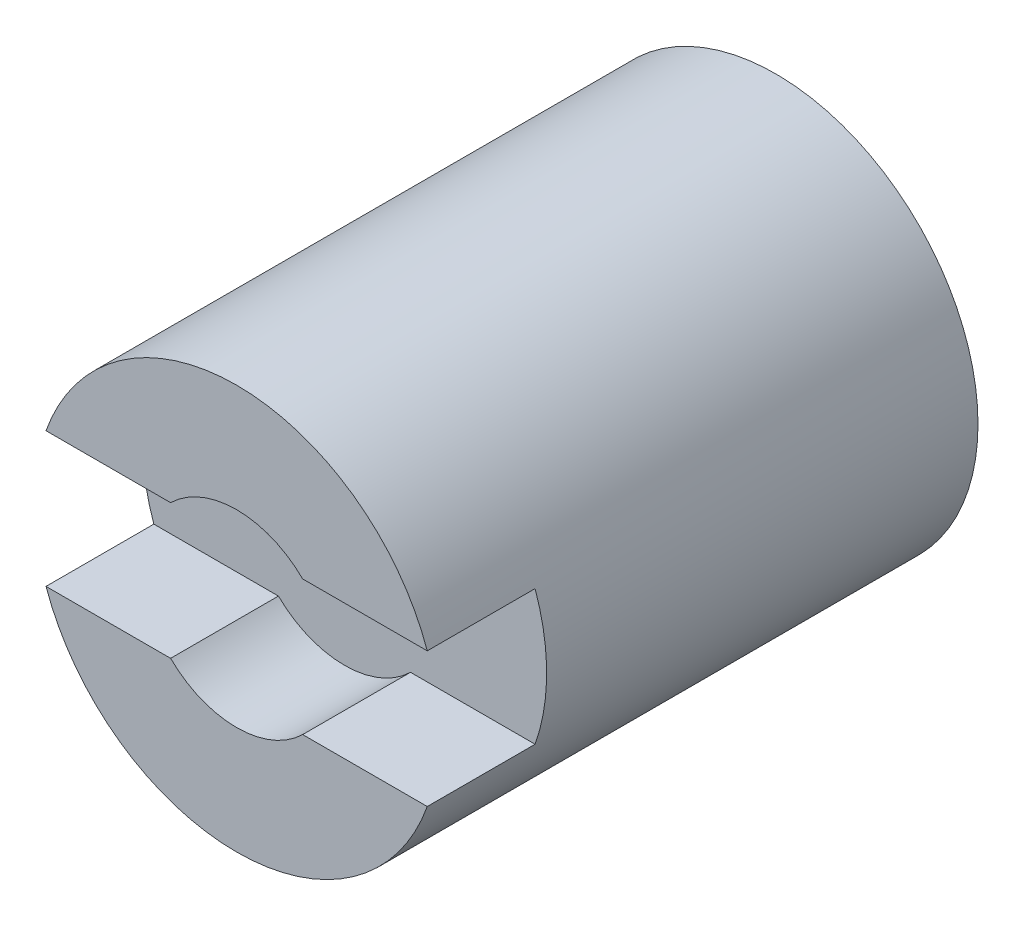
ISO-10303-21;
HEADER;
FILE_DESCRIPTION(('STEP AP214'),'2;1');
FILE_NAME('part.step','',(''),(''),'','','');
FILE_SCHEMA(('AUTOMOTIVE_DESIGN { 1 0 10303 214 1 1 1 1 }'));
ENDSEC;
DATA;
#1=APPLICATION_CONTEXT('core data for automotive mechanical design processes');
#2=APPLICATION_PROTOCOL_DEFINITION('international standard','automotive_design',2000,#1);
#3=PRODUCT_CONTEXT('',#1,'mechanical');
#4=PRODUCT('Part','Part','',(#3));
#5=PRODUCT_RELATED_PRODUCT_CATEGORY('part','',(#4));
#6=PRODUCT_DEFINITION_FORMATION('','',#4);
#7=PRODUCT_DEFINITION_CONTEXT('part definition',#1,'design');
#8=PRODUCT_DEFINITION('design','',#6,#7);
#9=PRODUCT_DEFINITION_SHAPE('','',#8);
#10=(LENGTH_UNIT() NAMED_UNIT(*) SI_UNIT(.MILLI.,.METRE.));
#11=(NAMED_UNIT(*) PLANE_ANGLE_UNIT() SI_UNIT($,.RADIAN.));
#12=(NAMED_UNIT(*) SI_UNIT($,.STERADIAN.) SOLID_ANGLE_UNIT());
#13=UNCERTAINTY_MEASURE_WITH_UNIT(LENGTH_MEASURE(1.E-05),#10,'distance_accuracy_value','');
#14=(GEOMETRIC_REPRESENTATION_CONTEXT(3) GLOBAL_UNCERTAINTY_ASSIGNED_CONTEXT((#13)) GLOBAL_UNIT_ASSIGNED_CONTEXT((#10,
#11,#12)) REPRESENTATION_CONTEXT('',''));
#15=CARTESIAN_POINT('',(0.,0.,0.));
#16=DIRECTION('',(0.,0.,1.));
#17=DIRECTION('',(1.,0.,0.));
#18=AXIS2_PLACEMENT_3D('',#15,#16,#17);
#19=CARTESIAN_POINT('',(0.,0.,20.));
#20=DIRECTION('',(0.,0.,1.));
#21=DIRECTION('',(1.,0.,0.));
#22=AXIS2_PLACEMENT_3D('',#19,#20,#21);
#23=PLANE('',#22);
#24=DIRECTION('',(-1.,0.,0.));
#25=VECTOR('',#24,1.);
#26=CARTESIAN_POINT('',(-9.,2.5,20.));
#27=LINE('',#26,#25);
#28=CARTESIAN_POINT('',(7.07106781186547,2.5,20.));
#29=VERTEX_POINT('',#28);
#30=CARTESIAN_POINT('',(2.44948974278318,2.5,20.));
#31=VERTEX_POINT('',#30);
#32=EDGE_CURVE('E197',#29,#31,#27,.T.);
#33=ORIENTED_EDGE('',*,*,#32,.F.);
#34=CARTESIAN_POINT('',(0.,0.,20.));
#35=DIRECTION('',(0.,0.,1.));
#36=DIRECTION('',(1.,0.,0.));
#37=AXIS2_PLACEMENT_3D('',#34,#35,#36);
#38=CIRCLE('',#37,7.5);
#39=CARTESIAN_POINT('',(-7.07106781186548,2.5,20.));
#40=VERTEX_POINT('',#39);
#41=EDGE_CURVE('E11',#29,#40,#38,.T.);
#42=ORIENTED_EDGE('',*,*,#41,.T.);
#43=CARTESIAN_POINT('',(-2.44948974278318,2.5,20.));
#44=VERTEX_POINT('',#43);
#45=EDGE_CURVE('E125',#44,#40,#27,.T.);
#46=ORIENTED_EDGE('',*,*,#45,.F.);
#47=CARTESIAN_POINT('',(0.,0.,20.));
#48=DIRECTION('',(0.,0.,1.));
#49=DIRECTION('',(1.,0.,0.));
#50=AXIS2_PLACEMENT_3D('',#47,#48,#49);
#51=CIRCLE('',#50,3.5);
#52=EDGE_CURVE('E135',#31,#44,#51,.T.);
#53=ORIENTED_EDGE('',*,*,#52,.F.);
#54=EDGE_LOOP('',(#33,#42,#46,#53));
#55=FACE_BOUND('',#54,.T.);
#56=ADVANCED_FACE('F35',(#55),#23,.T.);
#57=CARTESIAN_POINT('',(0.,0.,16.));
#58=DIRECTION('',(0.,0.,1.));
#59=DIRECTION('',(1.,0.,0.));
#60=AXIS2_PLACEMENT_3D('',#57,#58,#59);
#61=CYLINDRICAL_SURFACE('',#60,3.5);
#62=ORIENTED_EDGE('',*,*,#52,.T.);
#63=DIRECTION('',(0.,0.,1.));
#64=VECTOR('',#63,1.);
#65=CARTESIAN_POINT('',(-2.44948974278318,2.5,16.));
#66=LINE('',#65,#64);
#67=CARTESIAN_POINT('',(-2.44948974278318,2.5,16.));
#68=VERTEX_POINT('',#67);
#69=EDGE_CURVE('E211',#44,#68,#66,.F.);
#70=ORIENTED_EDGE('',*,*,#69,.T.);
#71=CARTESIAN_POINT('',(0.,0.,16.));
#72=DIRECTION('',(0.,0.,1.));
#73=DIRECTION('',(1.,0.,0.));
#74=AXIS2_PLACEMENT_3D('',#71,#72,#73);
#75=CIRCLE('',#74,3.5);
#76=CARTESIAN_POINT('',(2.44948974278318,2.5,16.));
#77=VERTEX_POINT('',#76);
#78=EDGE_CURVE('E133',#77,#68,#75,.T.);
#79=ORIENTED_EDGE('',*,*,#78,.F.);
#80=DIRECTION('',(0.,0.,1.));
#81=VECTOR('',#80,1.);
#82=CARTESIAN_POINT('',(2.44948974278318,2.5,16.));
#83=LINE('',#82,#81);
#84=EDGE_CURVE('E115',#77,#31,#83,.T.);
#85=ORIENTED_EDGE('',*,*,#84,.T.);
#86=EDGE_LOOP('',(#62,#70,#79,#85));
#87=FACE_BOUND('',#86,.T.);
#88=ADVANCED_FACE('F178',(#87),#61,.F.);
#89=CARTESIAN_POINT('',(0.,0.,20.));
#90=DIRECTION('',(0.,0.,-1.));
#91=DIRECTION('',(-1.,0.,0.));
#92=AXIS2_PLACEMENT_3D('',#89,#90,#91);
#93=CYLINDRICAL_SURFACE('',#92,7.5);
#94=CARTESIAN_POINT('',(0.,0.,16.));
#95=DIRECTION('',(0.,0.,1.));
#96=DIRECTION('',(1.,0.,0.));
#97=AXIS2_PLACEMENT_3D('',#94,#95,#96);
#98=CIRCLE('',#97,7.5);
#99=CARTESIAN_POINT('',(-7.07106781186548,2.5,16.));
#100=VERTEX_POINT('',#99);
#101=CARTESIAN_POINT('',(-7.07106781186548,-2.5,16.));
#102=VERTEX_POINT('',#101);
#103=EDGE_CURVE('E208',#100,#102,#98,.T.);
#104=ORIENTED_EDGE('',*,*,#103,.F.);
#105=DIRECTION('',(0.,0.,-1.));
#106=VECTOR('',#105,1.);
#107=CARTESIAN_POINT('',(-7.07106781186548,2.5,20.));
#108=LINE('',#107,#106);
#109=EDGE_CURVE('E207',#100,#40,#108,.F.);
#110=ORIENTED_EDGE('',*,*,#109,.T.);
#111=ORIENTED_EDGE('',*,*,#41,.F.);
#112=DIRECTION('',(0.,0.,-1.));
#113=VECTOR('',#112,1.);
#114=CARTESIAN_POINT('',(7.07106781186548,2.5,20.));
#115=LINE('',#114,#113);
#116=CARTESIAN_POINT('',(7.07106781186548,2.5,16.));
#117=VERTEX_POINT('',#116);
#118=EDGE_CURVE('E206',#29,#117,#115,.T.);
#119=ORIENTED_EDGE('',*,*,#118,.T.);
#120=CARTESIAN_POINT('',(7.07106781186548,-2.5,16.));
#121=VERTEX_POINT('',#120);
#122=EDGE_CURVE('E151',#121,#117,#98,.T.);
#123=ORIENTED_EDGE('',*,*,#122,.F.);
#124=DIRECTION('',(0.,0.,-1.));
#125=VECTOR('',#124,1.);
#126=CARTESIAN_POINT('',(7.07106781186548,-2.5,20.));
#127=LINE('',#126,#125);
#128=CARTESIAN_POINT('',(7.07106781186547,-2.5,20.));
#129=VERTEX_POINT('',#128);
#130=EDGE_CURVE('E116',#121,#129,#127,.F.);
#131=ORIENTED_EDGE('',*,*,#130,.T.);
#132=CARTESIAN_POINT('',(-7.07106781186548,-2.5,20.));
#133=VERTEX_POINT('',#132);
#134=EDGE_CURVE('E49',#133,#129,#38,.T.);
#135=ORIENTED_EDGE('',*,*,#134,.F.);
#136=DIRECTION('',(0.,0.,-1.));
#137=VECTOR('',#136,1.);
#138=CARTESIAN_POINT('',(-7.07106781186548,-2.5,20.));
#139=LINE('',#138,#137);
#140=EDGE_CURVE('E107',#133,#102,#139,.T.);
#141=ORIENTED_EDGE('',*,*,#140,.T.);
#142=EDGE_LOOP('',(#104,#110,#111,#119,#123,#131,#135,#141));
#143=FACE_BOUND('',#142,.T.);
#144=CARTESIAN_POINT('',(0.,-7.5,8.4));
#145=CARTESIAN_POINT('',(0.0779133674109521,-7.49999859125424,8.39999701606425));
#146=CARTESIAN_POINT('',(0.1558656317281,-7.49877336135813,8.39347392241294));
#147=CARTESIAN_POINT('',(0.309573945210475,-7.49400376714503,8.36757044773168));
#148=CARTESIAN_POINT('',(0.385328077045564,-7.4904574381938,8.34817917457057));
#149=CARTESIAN_POINT('',(0.532394902616653,-7.48144239226834,8.29715342074243));
#150=CARTESIAN_POINT('',(0.603711524827171,-7.47597540497422,8.2655299533969));
#151=CARTESIAN_POINT('',(0.740020082945075,-7.46371620380283,8.19096864543065));
#152=CARTESIAN_POINT('',(0.805012539027142,-7.45692409905732,8.14803173644098));
#153=CARTESIAN_POINT('',(0.927606272698275,-7.44267430493776,8.05152111041822));
#154=CARTESIAN_POINT('',(0.985121594567483,-7.43521030529913,7.99783912758889));
#155=CARTESIAN_POINT('',(1.09038485665154,-7.42050485674198,7.88159508808026));
#156=CARTESIAN_POINT('',(1.13813209897619,-7.41326342375634,7.81903239745046));
#157=CARTESIAN_POINT('',(1.22286079770395,-7.3997616811699,7.68619612490867));
#158=CARTESIAN_POINT('',(1.25975491870461,-7.3935095083739,7.61586593691635));
#159=CARTESIAN_POINT('',(1.32117102449928,-7.38278303352665,7.46986942491673));
#160=CARTESIAN_POINT('',(1.34569406634903,-7.37830857958388,7.3942035574503));
#161=CARTESIAN_POINT('',(1.38139624396322,-7.37170763757229,7.24060292392608));
#162=CARTESIAN_POINT('',(1.39272521996421,-7.36955480490632,7.1627041405356));
#163=CARTESIAN_POINT('',(1.4021827516858,-7.36776141784466,7.00608398167344));
#164=CARTESIAN_POINT('',(1.40031248054661,-7.36812064017918,6.92736267992761));
#165=CARTESIAN_POINT('',(1.38354613242022,-7.37128678738226,6.7724169984697));
#166=CARTESIAN_POINT('',(1.36882035466186,-7.37406170969313,6.69617344056423));
#167=CARTESIAN_POINT('',(1.3270291603155,-7.38169633260816,6.54725839154638));
#168=CARTESIAN_POINT('',(1.29996322359251,-7.38655612108846,6.47458705114524));
#169=CARTESIAN_POINT('',(1.23409321060501,-7.39784640181638,6.33438053732231));
#170=CARTESIAN_POINT('',(1.1952202876869,-7.40428606278954,6.26687847735335));
#171=CARTESIAN_POINT('',(1.10688846048193,-7.41800442531871,6.13929113271793));
#172=CARTESIAN_POINT('',(1.05742849105322,-7.4252832112634,6.07920659527351));
#173=CARTESIAN_POINT('',(0.94840797169838,-7.43999918071803,5.96717585534892));
#174=CARTESIAN_POINT('',(0.888701740330239,-7.4474370626664,5.91537140740493));
#175=CARTESIAN_POINT('',(0.761371236571213,-7.46152866848707,5.82249261726087));
#176=CARTESIAN_POINT('',(0.693746886132019,-7.46818238462862,5.78141838084058));
#177=CARTESIAN_POINT('',(0.552352497236687,-7.47996921746132,5.71114541179937));
#178=CARTESIAN_POINT('',(0.4785750114332,-7.48510045620092,5.68196132908119));
#179=CARTESIAN_POINT('',(0.327047822563483,-7.49324964825403,5.63643992209997));
#180=CARTESIAN_POINT('',(0.249298538581314,-7.49626782403512,5.62010124542414));
#181=CARTESIAN_POINT('',(0.093254429656113,-7.49982029245223,5.60093153725318));
#182=CARTESIAN_POINT('',(0.0149842535036367,-7.50039030063849,5.5979062644765));
#183=CARTESIAN_POINT('',(-0.140943599366161,-7.49908083147953,5.60492834119282));
#184=CARTESIAN_POINT('',(-0.218601305713759,-7.49720147337103,5.61497505433319));
#185=CARTESIAN_POINT('',(-0.370484374990088,-7.4912266743448,5.64769441976653));
#186=CARTESIAN_POINT('',(-0.444731629242859,-7.48714847562436,5.6702688756202));
#187=CARTESIAN_POINT('',(-0.588387527084438,-7.47723139159912,5.72729672386629));
#188=CARTESIAN_POINT('',(-0.657795844049151,-7.47139238758289,5.76175091719927));
#189=CARTESIAN_POINT('',(-0.79063321310229,-7.45851229738673,5.84199075585914));
#190=CARTESIAN_POINT('',(-0.853989283234835,-7.45145886519141,5.88789520092188));
#191=CARTESIAN_POINT('',(-0.972168673464306,-7.43696439317826,5.989571615031));
#192=CARTESIAN_POINT('',(-1.02699120347712,-7.42952331755519,6.04534449673365));
#193=CARTESIAN_POINT('',(-1.12728462577657,-7.41497385349456,6.16605362487332));
#194=CARTESIAN_POINT('',(-1.17262301470252,-7.40787112903525,6.23110076030566));
#195=CARTESIAN_POINT('',(-1.25172982219398,-7.39491622090559,6.36800191216051));
#196=CARTESIAN_POINT('',(-1.28549866837976,-7.3890639910189,6.43985567687881));
#197=CARTESIAN_POINT('',(-1.34031952638564,-7.37931705682305,6.58799260560827));
#198=CARTESIAN_POINT('',(-1.36143248761536,-7.3754129858809,6.6642525690897));
#199=CARTESIAN_POINT('',(-1.390530388651,-7.36998291741041,6.81931706000609));
#200=CARTESIAN_POINT('',(-1.39851679495834,-7.36845665423389,6.89812130219057));
#201=CARTESIAN_POINT('',(-1.40108615188244,-7.36796839970978,7.05471031204299));
#202=CARTESIAN_POINT('',(-1.39587809397871,-7.36896642490907,7.13249160271129));
#203=CARTESIAN_POINT('',(-1.37266367637821,-7.37332567909415,7.28604927437609));
#204=CARTESIAN_POINT('',(-1.35465739153333,-7.37668689425856,7.36182566709577));
#205=CARTESIAN_POINT('',(-1.30644549635851,-7.38537703463725,7.50911143559961));
#206=CARTESIAN_POINT('',(-1.27626232270117,-7.3907023393549,7.58062838304223));
#207=CARTESIAN_POINT('',(-1.20457623641904,-7.4027232291267,7.71761660298537));
#208=CARTESIAN_POINT('',(-1.16307253389003,-7.40941890979242,7.78308745318494));
#209=CARTESIAN_POINT('',(-1.06919613853274,-7.42355034378414,7.90717225641319));
#210=CARTESIAN_POINT('',(-1.01667127704805,-7.43099560595939,7.965670022843));
#211=CARTESIAN_POINT('',(-0.902561011125132,-7.44571597358462,8.07309122462733));
#212=CARTESIAN_POINT('',(-0.840973527873773,-7.45299103954952,8.12201245727018));
#213=CARTESIAN_POINT('',(-0.70982892852024,-7.46662732048264,8.20929881521798));
#214=CARTESIAN_POINT('',(-0.640205682766072,-7.47297981403672,8.24756598598391));
#215=CARTESIAN_POINT('',(-0.495422278764189,-7.48397004795432,8.31179900370326));
#216=CARTESIAN_POINT('',(-0.420267411958568,-7.4886094021508,8.33777643451281));
#217=CARTESIAN_POINT('',(-0.28740712601829,-7.49470196694218,8.37140266984245));
#218=CARTESIAN_POINT('',(-0.230479630074963,-7.49667753456189,8.38210838967683));
#219=CARTESIAN_POINT('',(-0.115708559017359,-7.499327057923,8.39640807378765));
#220=CARTESIAN_POINT('',(-0.0578650068755151,-7.50000104625286,8.40000221612117));
#221=CARTESIAN_POINT('',(0.,-7.5,8.4));
#222=B_SPLINE_CURVE_WITH_KNOTS('',3,(#144,#145,#146,#147,#148,#149,#150,#151,#152,#153,#154,
#155,#156,#157,#158,#159,#160,#161,#162,#163,#164,#165,#166,#167,#168,#169,#170,#171,#172,#173,
#174,#175,#176,#177,#178,#179,#180,#181,#182,#183,#184,#185,#186,#187,#188,#189,#190,#191,#192,
#193,#194,#195,#196,#197,#198,#199,#200,#201,#202,#203,#204,#205,#206,#207,#208,#209,#210,#211,
#212,#213,#214,#215,#216,#217,#218,#219,#220,#221),.UNSPECIFIED.,.T.,.F.,(4,2,2,2,2,2,2,2,2,2,2,
2,2,2,2,2,2,2,2,2,2,2,2,2,2,2,2,2,2,2,2,2,2,2,2,2,2,2,4),(0.,0.233528490493102,
0.467254901205797,0.700771363087736,0.934268601532527,1.17024907459718,1.40624640163875,
1.64409388270997,1.88192103728866,2.11702009284213,2.35209825321271,2.58410875235605,
2.81612903159522,3.04952907799129,3.28295261735168,3.5200216276816,3.75709297497979,
3.99445554179438,4.23179311483481,4.4656562257738,4.699507952533,4.93155204918364,
5.16361179347652,5.39818740209162,5.63278471616096,5.87046805589724,6.10814260970442,
6.34466315484716,6.5811572740696,6.81392898125117,7.04669932705199,7.27904272374926,
7.51140233664979,7.74721048008594,7.98307279850994,8.22103697750465,8.45877641114053,
8.63221861376357,8.80565647374898),.UNSPECIFIED.);
#223=CARTESIAN_POINT('',(0.,-7.5,8.4));
#224=VERTEX_POINT('',#223);
#225=EDGE_CURVE('E144',#224,#224,#222,.T.);
#226=ORIENTED_EDGE('',*,*,#225,.T.);
#227=EDGE_LOOP('',(#226));
#228=FACE_BOUND('',#227,.T.);
#229=CARTESIAN_POINT('',(0.,0.,0.));
#230=DIRECTION('',(0.,0.,1.));
#231=DIRECTION('',(1.,0.,0.));
#232=AXIS2_PLACEMENT_3D('',#229,#230,#231);
#233=CIRCLE('',#232,7.5);
#234=CARTESIAN_POINT('',(7.5,0.,0.));
#235=VERTEX_POINT('',#234);
#236=EDGE_CURVE('E131',#235,#235,#233,.T.);
#237=ORIENTED_EDGE('',*,*,#236,.T.);
#238=EDGE_LOOP('',(#237));
#239=FACE_BOUND('',#238,.T.);
#240=ADVANCED_FACE('F37',(#143,#228,#239),#93,.T.);
#241=DIRECTION('',(1.,0.,0.));
#242=VECTOR('',#241,1.);
#243=CARTESIAN_POINT('',(-9.,-2.5,20.));
#244=LINE('',#243,#242);
#245=CARTESIAN_POINT('',(-2.44948974278318,-2.5,20.));
#246=VERTEX_POINT('',#245);
#247=EDGE_CURVE('E110',#133,#246,#244,.T.);
#248=ORIENTED_EDGE('',*,*,#247,.F.);
#249=ORIENTED_EDGE('',*,*,#134,.T.);
#250=CARTESIAN_POINT('',(2.44948974278318,-2.5,20.));
#251=VERTEX_POINT('',#250);
#252=EDGE_CURVE('E126',#251,#129,#244,.T.);
#253=ORIENTED_EDGE('',*,*,#252,.F.);
#254=EDGE_CURVE('E124',#246,#251,#51,.T.);
#255=ORIENTED_EDGE('',*,*,#254,.F.);
#256=EDGE_LOOP('',(#248,#249,#253,#255));
#257=FACE_BOUND('',#256,.T.);
#258=ADVANCED_FACE('F121',(#257),#23,.T.);
#259=CARTESIAN_POINT('',(0.,0.,0.));
#260=DIRECTION('',(0.,0.,1.));
#261=DIRECTION('',(1.,0.,0.));
#262=AXIS2_PLACEMENT_3D('',#259,#260,#261);
#263=PLANE('',#262);
#264=CARTESIAN_POINT('',(0.,0.,0.));
#265=DIRECTION('',(0.,0.,-1.));
#266=DIRECTION('',(-1.,0.,0.));
#267=AXIS2_PLACEMENT_3D('',#264,#265,#266);
#268=CIRCLE('',#267,1.75);
#269=CARTESIAN_POINT('',(-1.75,0.,0.));
#270=VERTEX_POINT('',#269);
#271=EDGE_CURVE('E140',#270,#270,#268,.T.);
#272=ORIENTED_EDGE('',*,*,#271,.F.);
#273=EDGE_LOOP('',(#272));
#274=FACE_BOUND('',#273,.T.);
#275=ORIENTED_EDGE('',*,*,#236,.F.);
#276=EDGE_LOOP('',(#275));
#277=FACE_BOUND('',#276,.T.);
#278=ADVANCED_FACE('F176',(#274,#277),#263,.F.);
#279=ORIENTED_EDGE('',*,*,#254,.T.);
#280=DIRECTION('',(0.,0.,1.));
#281=VECTOR('',#280,1.);
#282=CARTESIAN_POINT('',(2.44948974278318,-2.5,16.));
#283=LINE('',#282,#281);
#284=CARTESIAN_POINT('',(2.44948974278318,-2.5,16.));
#285=VERTEX_POINT('',#284);
#286=EDGE_CURVE('E218',#251,#285,#283,.F.);
#287=ORIENTED_EDGE('',*,*,#286,.T.);
#288=CARTESIAN_POINT('',(-2.44948974278318,-2.5,16.));
#289=VERTEX_POINT('',#288);
#290=EDGE_CURVE('E138',#289,#285,#75,.T.);
#291=ORIENTED_EDGE('',*,*,#290,.F.);
#292=DIRECTION('',(0.,0.,1.));
#293=VECTOR('',#292,1.);
#294=CARTESIAN_POINT('',(-2.44948974278318,-2.5,16.));
#295=LINE('',#294,#293);
#296=EDGE_CURVE('E221',#289,#246,#295,.T.);
#297=ORIENTED_EDGE('',*,*,#296,.T.);
#298=EDGE_LOOP('',(#279,#287,#291,#297));
#299=FACE_BOUND('',#298,.T.);
#300=ADVANCED_FACE('F173',(#299),#61,.F.);
#301=CARTESIAN_POINT('',(0.,0.,16.));
#302=DIRECTION('',(0.,0.,1.));
#303=DIRECTION('',(1.,0.,0.));
#304=AXIS2_PLACEMENT_3D('',#301,#302,#303);
#305=PLANE('',#304);
#306=ORIENTED_EDGE('',*,*,#290,.T.);
#307=DIRECTION('',(1.,0.,0.));
#308=VECTOR('',#307,1.);
#309=CARTESIAN_POINT('',(-9.,-2.5,16.));
#310=LINE('',#309,#308);
#311=EDGE_CURVE('E202',#285,#121,#310,.T.);
#312=ORIENTED_EDGE('',*,*,#311,.T.);
#313=ORIENTED_EDGE('',*,*,#122,.T.);
#314=DIRECTION('',(-1.,0.,0.));
#315=VECTOR('',#314,1.);
#316=CARTESIAN_POINT('',(-9.,2.5,16.));
#317=LINE('',#316,#315);
#318=EDGE_CURVE('E64',#117,#77,#317,.T.);
#319=ORIENTED_EDGE('',*,*,#318,.T.);
#320=ORIENTED_EDGE('',*,*,#78,.T.);
#321=EDGE_CURVE('E223',#68,#100,#317,.T.);
#322=ORIENTED_EDGE('',*,*,#321,.T.);
#323=ORIENTED_EDGE('',*,*,#103,.T.);
#324=EDGE_CURVE('E57',#102,#289,#310,.T.);
#325=ORIENTED_EDGE('',*,*,#324,.T.);
#326=EDGE_LOOP('',(#306,#312,#313,#319,#320,#322,#323,#325));
#327=FACE_BOUND('',#326,.T.);
#328=ADVANCED_FACE('F169',(#327),#305,.T.);
#329=CARTESIAN_POINT('',(0.,0.,14.));
#330=DIRECTION('',(0.,0.,-1.));
#331=DIRECTION('',(-1.,0.,0.));
#332=AXIS2_PLACEMENT_3D('',#329,#330,#331);
#333=CYLINDRICAL_SURFACE('',#332,1.75);
#334=CARTESIAN_POINT('',(0.,-1.75,8.4));
#335=CARTESIAN_POINT('',(-0.0671979322416646,-1.74999491625747,8.39999476261131));
#336=CARTESIAN_POINT('',(-0.134493263163109,-1.74608959541021,8.39512141822933));
#337=CARTESIAN_POINT('',(-0.266923527684139,-1.73081486896077,8.37595502363645));
#338=CARTESIAN_POINT('',(-0.332053346498951,-1.71942895157439,8.36164113521492));
#339=CARTESIAN_POINT('',(-0.457866449255663,-1.69026705710654,8.32462520964426));
#340=CARTESIAN_POINT('',(-0.518575190713299,-1.67253184219989,8.30197665531606));
#341=CARTESIAN_POINT('',(-0.634848424561107,-1.63195207578548,8.24941785824782));
#342=CARTESIAN_POINT('',(-0.690412900653904,-1.60910750809172,8.21950759250329));
#343=CARTESIAN_POINT('',(-0.814226866427587,-1.55102965359143,8.14196014501928));
#344=CARTESIAN_POINT('',(-0.880157375887776,-1.51425224035371,8.09177675952338));
#345=CARTESIAN_POINT('',(-1.00128957457156,-1.43704534808961,7.9819053538367));
#346=CARTESIAN_POINT('',(-1.0564593306718,-1.39660550536807,7.92218997250839));
#347=CARTESIAN_POINT('',(-1.15651143275,-1.31499201144487,7.793258211189));
#348=CARTESIAN_POINT('',(-1.20121846921663,-1.27381681632366,7.72390725892719));
#349=CARTESIAN_POINT('',(-1.2785278408792,-1.1961747691715,7.57642285223663));
#350=CARTESIAN_POINT('',(-1.31117069570161,-1.1596924296223,7.49831996627632));
#351=CARTESIAN_POINT('',(-1.35160230640457,-1.11184956610758,7.36828473382731));
#352=CARTESIAN_POINT('',(-1.3640583307451,-1.09640109439161,7.31933178341412));
#353=CARTESIAN_POINT('',(-1.38371377758782,-1.07148922409054,7.21895112111535));
#354=CARTESIAN_POINT('',(-1.3909261231723,-1.0620111192581,7.16752982853242));
#355=CARTESIAN_POINT('',(-1.39957888099801,-1.0505896384278,7.06286523679036));
#356=CARTESIAN_POINT('',(-1.40096841929399,-1.04871267848591,7.00960996062547));
#357=CARTESIAN_POINT('',(-1.39768637189776,-1.05307973611965,6.90360657557706));
#358=CARTESIAN_POINT('',(-1.3930096565776,-1.05933062662169,6.85085893396358));
#359=CARTESIAN_POINT('',(-1.37686711898359,-1.0802450490998,6.7394443881711));
#360=CARTESIAN_POINT('',(-1.36445265743935,-1.09607289434669,6.68114439576221));
#361=CARTESIAN_POINT('',(-1.33311183144194,-1.13398221955396,6.56842510832406));
#362=CARTESIAN_POINT('',(-1.31416617949577,-1.15608218739051,6.51401789042209));
#363=CARTESIAN_POINT('',(-1.25981871535851,-1.21559281311588,6.38353652577137));
#364=CARTESIAN_POINT('',(-1.22090420616841,-1.25519361077691,6.30993811118731));
#365=CARTESIAN_POINT('',(-1.13146927248287,-1.33639646042498,6.17139832554022));
#366=CARTESIAN_POINT('',(-1.08093192831766,-1.37800135934319,6.10646979540861));
#367=CARTESIAN_POINT('',(-0.96702072828435,-1.4602892637785,5.98410766001738));
#368=CARTESIAN_POINT('',(-0.903340907187177,-1.50091822482303,5.9269196543895));
#369=CARTESIAN_POINT('',(-0.764389437510248,-1.57620310046738,5.82393035039245));
#370=CARTESIAN_POINT('',(-0.689149751646665,-1.61087494276619,5.77809853870474));
#371=CARTESIAN_POINT('',(-0.551444470062173,-1.66197209949679,5.71160600682247));
#372=CARTESIAN_POINT('',(-0.491524409116812,-1.68077749854839,5.68749684692305));
#373=CARTESIAN_POINT('',(-0.367439746629622,-1.71218294880071,5.64751148427804));
#374=CARTESIAN_POINT('',(-0.30327838544084,-1.72478767655511,5.63162907642608));
#375=CARTESIAN_POINT('',(-0.171999263640941,-1.74279234971933,5.60900301725761));
#376=CARTESIAN_POINT('',(-0.104867914860047,-1.74815465014742,5.60230711309967));
#377=CARTESIAN_POINT('',(0.0298256018185202,-1.75104077920124,5.59869866529554));
#378=CARTESIAN_POINT('',(0.0973876871251498,-1.74856606793902,5.60178429925311));
#379=CARTESIAN_POINT('',(0.225222672556177,-1.73653800951217,5.6168579728175));
#380=CARTESIAN_POINT('',(0.285642626554698,-1.72757446328525,5.62810442778419));
#381=CARTESIAN_POINT('',(0.403434969634318,-1.70392259604556,5.65801052158268));
#382=CARTESIAN_POINT('',(0.460806448543058,-1.68923257609215,5.67667236045587));
#383=CARTESIAN_POINT('',(0.574865123476419,-1.65402893198375,5.72190528075484));
#384=CARTESIAN_POINT('',(0.631290568876672,-1.63321133528393,5.7488941288802));
#385=CARTESIAN_POINT('',(0.738786967853227,-1.5874854129318,5.80920342742828));
#386=CARTESIAN_POINT('',(0.78985765420573,-1.56257688328469,5.84252419360578));
#387=CARTESIAN_POINT('',(0.895476819895458,-1.50495557306859,5.92145737284896));
#388=CARTESIAN_POINT('',(0.948855669960248,-1.47165781556883,5.96820260462305));
#389=CARTESIAN_POINT('',(1.04757517421973,-1.40310546129706,6.06856944754852));
#390=CARTESIAN_POINT('',(1.09289204235346,-1.36784546415289,6.12221062794266));
#391=CARTESIAN_POINT('',(1.15898087354498,-1.31161672095397,6.21350736286637));
#392=CARTESIAN_POINT('',(1.18240064338544,-1.29047640981302,6.24916234254161));
#393=CARTESIAN_POINT('',(1.22608056025509,-1.24905470822415,6.32282564873572));
#394=CARTESIAN_POINT('',(1.24633903119255,-1.22877377753466,6.36083520881383));
#395=CARTESIAN_POINT('',(1.3020124497182,-1.17051317292751,6.47823951749727));
#396=CARTESIAN_POINT('',(1.33260616745399,-1.13486282177681,6.56139203440472));
#397=CARTESIAN_POINT('',(1.36752585123894,-1.09213741882174,6.69628273161349));
#398=CARTESIAN_POINT('',(1.37745816815164,-1.07946841190278,6.74480178213238));
#399=CARTESIAN_POINT('',(1.39215109242793,-1.06045320725826,6.84378042724155));
#400=CARTESIAN_POINT('',(1.39692474648137,-1.05409106234,6.8942347906586));
#401=CARTESIAN_POINT('',(1.40092472774277,-1.04877326182596,6.99604576637967));
#402=CARTESIAN_POINT('',(1.40012124847285,-1.04985740189406,7.0474057610443));
#403=CARTESIAN_POINT('',(1.39297562677922,-1.05931538137448,7.14908819080132));
#404=CARTESIAN_POINT('',(1.38662470315617,-1.06770077807605,7.19940885137188));
#405=CARTESIAN_POINT('',(1.36645386654446,-1.0934495084365,7.31122640089182));
#406=CARTESIAN_POINT('',(1.35106298760894,-1.11264464439433,7.3720024945677));
#407=CARTESIAN_POINT('',(1.31325887059283,-1.15702251852601,7.48903707946869));
#408=CARTESIAN_POINT('',(1.29082494492284,-1.18222284254692,7.54528164058072));
#409=CARTESIAN_POINT('',(1.22808717421822,-1.24787062944927,7.67775686808608));
#410=CARTESIAN_POINT('',(1.18429388937313,-1.29004759358992,7.75147439126104));
#411=CARTESIAN_POINT('',(1.08438379672324,-1.37511687020611,7.88959280562839));
#412=CARTESIAN_POINT('',(1.02825301896758,-1.4180099422535,7.95398299708954));
#413=CARTESIAN_POINT('',(0.903049283410034,-1.5009063914611,8.07334839749436));
#414=CARTESIAN_POINT('',(0.833817300372079,-1.54086486189889,8.12819007567987));
#415=CARTESIAN_POINT('',(0.683470869193748,-1.61315430391639,8.22507084000434));
#416=CARTESIAN_POINT('',(0.602392538665694,-1.64550770651904,8.2671476852703));
#417=CARTESIAN_POINT('',(0.458502249749996,-1.6899605589196,8.32426178263163));
#418=CARTESIAN_POINT('',(0.3983708925407,-1.7052239425191,8.34364195732871));
#419=CARTESIAN_POINT('',(0.274905426831879,-1.72940837226425,8.3742062950759));
#420=CARTESIAN_POINT('',(0.211580177796342,-1.73834602931122,8.38541192628493));
#421=CARTESIAN_POINT('',(0.123116284622081,-1.74583786411905,8.39479435693637));
#422=CARTESIAN_POINT('',(0.0985658855956588,-1.74739549099545,8.39674323115111));
#423=CARTESIAN_POINT('',(0.049348053826063,-1.74947760746058,8.39934715842546));
#424=CARTESIAN_POINT('',(0.0246805962653039,-1.75000186716753,8.40000192359901));
#425=CARTESIAN_POINT('',(0.,-1.75,8.4));
#426=B_SPLINE_CURVE_WITH_KNOTS('',3,(#334,#335,#336,#337,#338,#339,#340,#341,#342,#343,#344,
#345,#346,#347,#348,#349,#350,#351,#352,#353,#354,#355,#356,#357,#358,#359,#360,#361,#362,#363,
#364,#365,#366,#367,#368,#369,#370,#371,#372,#373,#374,#375,#376,#377,#378,#379,#380,#381,#382,
#383,#384,#385,#386,#387,#388,#389,#390,#391,#392,#393,#394,#395,#396,#397,#398,#399,#400,#401,
#402,#403,#404,#405,#406,#407,#408,#409,#410,#411,#412,#413,#414,#415,#416,#417,#418,#419,#420,
#421,#422,#423,#424,#425),.UNSPECIFIED.,.T.,.F.,(4,2,2,2,2,2,2,2,2,2,2,2,2,2,2,2,2,2,2,2,2,2,2,
2,2,2,2,2,2,2,2,2,2,2,2,2,2,2,2,2,2,2,2,2,2,4),(0.,0.201485624194546,0.403417484847539,
0.604075540075424,0.804734230979563,1.07525521740071,1.34656716731496,1.62214319235837,
1.89678505047589,2.05474140438791,2.21230714185677,2.37124669950531,2.53032074420176,
2.71431041022407,2.89884814446994,3.17398023731811,3.44951541120672,3.73238721301894,
4.01449050828474,4.21549784687362,4.41635335217207,4.61824890547975,4.8201068458814,
5.00560903456711,5.19116630031701,5.38819927136096,5.58524207045945,5.81955876074527,
6.05455570979631,6.19721592522134,6.33995152266596,6.62382827116326,6.77665310721536,
6.92909052534197,7.08234325616891,7.23583901539471,7.4314413104139,7.62762361136929,
7.91283436008734,8.19836973687392,8.487623614077,8.77601332552505,8.97023182839272,
9.16393841603242,9.23792401809345,9.31192607705747),.UNSPECIFIED.);
#427=CARTESIAN_POINT('',(0.,-1.75,8.4));
#428=VERTEX_POINT('',#427);
#429=EDGE_CURVE('E40',#428,#428,#426,.T.);
#430=ORIENTED_EDGE('',*,*,#429,.T.);
#431=EDGE_LOOP('',(#430));
#432=FACE_BOUND('',#431,.T.);
#433=CARTESIAN_POINT('',(0.,0.,14.));
#434=DIRECTION('',(0.,0.,-1.));
#435=DIRECTION('',(-1.,0.,0.));
#436=AXIS2_PLACEMENT_3D('',#433,#434,#435);
#437=CIRCLE('',#436,1.75);
#438=CARTESIAN_POINT('',(-1.75,0.,14.));
#439=VERTEX_POINT('',#438);
#440=EDGE_CURVE('E143',#439,#439,#437,.T.);
#441=ORIENTED_EDGE('',*,*,#440,.F.);
#442=EDGE_LOOP('',(#441));
#443=FACE_BOUND('',#442,.T.);
#444=ORIENTED_EDGE('',*,*,#271,.T.);
#445=EDGE_LOOP('',(#444));
#446=FACE_BOUND('',#445,.T.);
#447=ADVANCED_FACE('F164',(#432,#443,#446),#333,.F.);
#448=CARTESIAN_POINT('',(0.,0.,14.));
#449=DIRECTION('',(0.,0.,-1.));
#450=DIRECTION('',(-1.,0.,0.));
#451=AXIS2_PLACEMENT_3D('',#448,#449,#450);
#452=PLANE('',#451);
#453=ORIENTED_EDGE('',*,*,#440,.T.);
#454=EDGE_LOOP('',(#453));
#455=FACE_BOUND('',#454,.T.);
#456=ADVANCED_FACE('F159',(#455),#452,.T.);
#457=CARTESIAN_POINT('',(0.,-14.,7.));
#458=DIRECTION('',(0.,1.,0.));
#459=DIRECTION('',(0.,0.,1.));
#460=AXIS2_PLACEMENT_3D('',#457,#458,#459);
#461=CYLINDRICAL_SURFACE('',#460,1.4);
#462=ORIENTED_EDGE('',*,*,#429,.F.);
#463=EDGE_LOOP('',(#462));
#464=FACE_BOUND('',#463,.T.);
#465=ORIENTED_EDGE('',*,*,#225,.F.);
#466=EDGE_LOOP('',(#465));
#467=FACE_BOUND('',#466,.T.);
#468=ADVANCED_FACE('F153',(#464,#467),#461,.F.);
#469=CARTESIAN_POINT('',(-9.,-2.5,16.));
#470=DIRECTION('',(0.,-1.,0.));
#471=DIRECTION('',(0.,0.,-1.));
#472=AXIS2_PLACEMENT_3D('',#469,#470,#471);
#473=PLANE('',#472);
#474=ORIENTED_EDGE('',*,*,#311,.F.);
#475=ORIENTED_EDGE('',*,*,#286,.F.);
#476=ORIENTED_EDGE('',*,*,#252,.T.);
#477=ORIENTED_EDGE('',*,*,#130,.F.);
#478=EDGE_LOOP('',(#474,#475,#476,#477));
#479=FACE_BOUND('',#478,.T.);
#480=ADVANCED_FACE('F158',(#479),#473,.F.);
#481=CARTESIAN_POINT('',(-9.,2.5,16.));
#482=DIRECTION('',(0.,1.,0.));
#483=DIRECTION('',(0.,0.,1.));
#484=AXIS2_PLACEMENT_3D('',#481,#482,#483);
#485=PLANE('',#484);
#486=ORIENTED_EDGE('',*,*,#32,.T.);
#487=ORIENTED_EDGE('',*,*,#84,.F.);
#488=ORIENTED_EDGE('',*,*,#318,.F.);
#489=ORIENTED_EDGE('',*,*,#118,.F.);
#490=EDGE_LOOP('',(#486,#487,#488,#489));
#491=FACE_BOUND('',#490,.T.);
#492=ADVANCED_FACE('F261',(#491),#485,.F.);
#493=ORIENTED_EDGE('',*,*,#321,.F.);
#494=ORIENTED_EDGE('',*,*,#69,.F.);
#495=ORIENTED_EDGE('',*,*,#45,.T.);
#496=ORIENTED_EDGE('',*,*,#109,.F.);
#497=EDGE_LOOP('',(#493,#494,#495,#496));
#498=FACE_BOUND('',#497,.T.);
#499=ADVANCED_FACE('F269',(#498),#485,.F.);
#500=ORIENTED_EDGE('',*,*,#247,.T.);
#501=ORIENTED_EDGE('',*,*,#296,.F.);
#502=ORIENTED_EDGE('',*,*,#324,.F.);
#503=ORIENTED_EDGE('',*,*,#140,.F.);
#504=EDGE_LOOP('',(#500,#501,#502,#503));
#505=FACE_BOUND('',#504,.T.);
#506=ADVANCED_FACE('F109',(#505),#473,.F.);
#507=CLOSED_SHELL('',(#56,#88,#240,#258,#278,#300,#328,#447,#456,#468,#480,#492,#499,#506));
#508=MANIFOLD_SOLID_BREP('B2',#507);
#509=ADVANCED_BREP_SHAPE_REPRESENTATION('',(#18,#508),#14);
#510=SHAPE_DEFINITION_REPRESENTATION(#9,#509);
ENDSEC;
END-ISO-10303-21;
